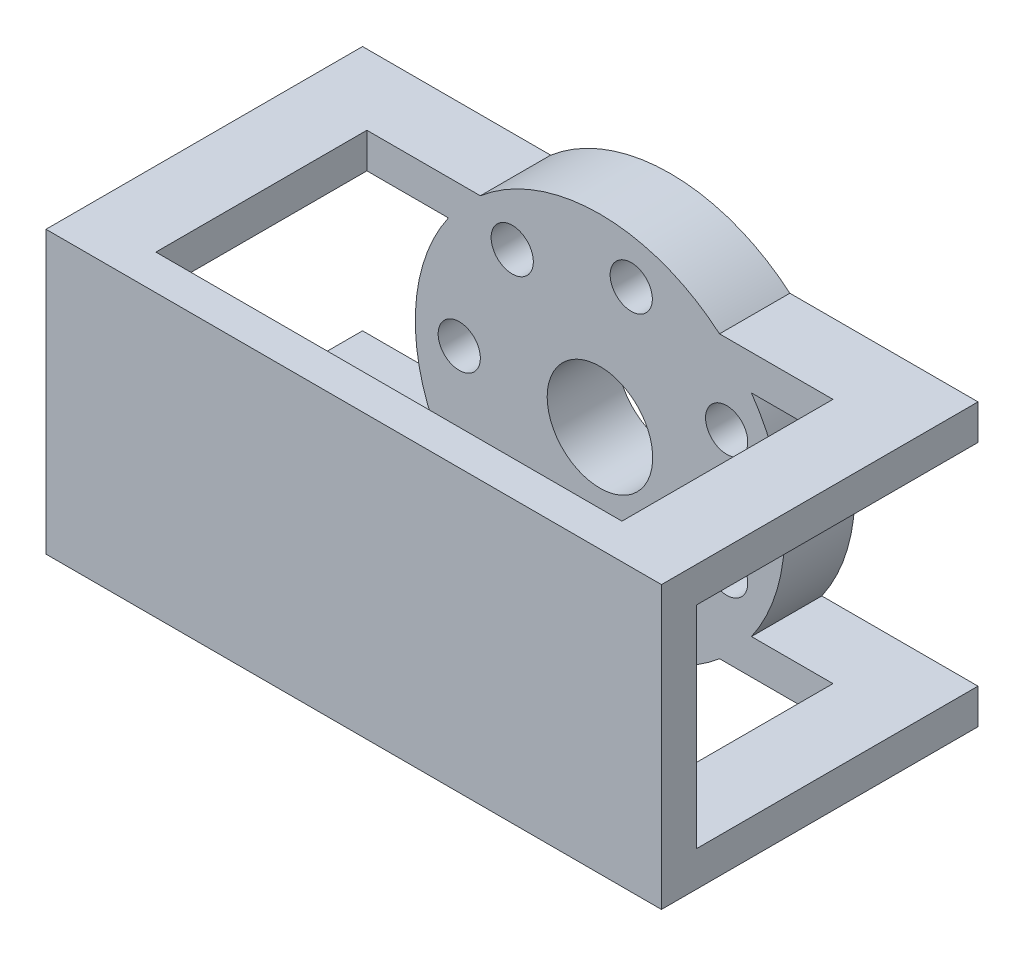
ISO-10303-21;
HEADER;
FILE_DESCRIPTION(('STEP AP214'),'2;1');
FILE_NAME('part.step','',(''),(''),'','','');
FILE_SCHEMA(('AUTOMOTIVE_DESIGN { 1 0 10303 214 1 1 1 1 }'));
ENDSEC;
DATA;
#1=APPLICATION_CONTEXT('core data for automotive mechanical design processes');
#2=APPLICATION_PROTOCOL_DEFINITION('international standard','automotive_design',2000,#1);
#3=PRODUCT_CONTEXT('',#1,'mechanical');
#4=PRODUCT('Part','Part','',(#3));
#5=PRODUCT_RELATED_PRODUCT_CATEGORY('part','',(#4));
#6=PRODUCT_DEFINITION_FORMATION('','',#4);
#7=PRODUCT_DEFINITION_CONTEXT('part definition',#1,'design');
#8=PRODUCT_DEFINITION('design','',#6,#7);
#9=PRODUCT_DEFINITION_SHAPE('','',#8);
#10=(LENGTH_UNIT() NAMED_UNIT(*) SI_UNIT(.MILLI.,.METRE.));
#11=(NAMED_UNIT(*) PLANE_ANGLE_UNIT() SI_UNIT($,.RADIAN.));
#12=(NAMED_UNIT(*) SI_UNIT($,.STERADIAN.) SOLID_ANGLE_UNIT());
#13=UNCERTAINTY_MEASURE_WITH_UNIT(LENGTH_MEASURE(1.E-05),#10,'distance_accuracy_value','');
#14=(GEOMETRIC_REPRESENTATION_CONTEXT(3) GLOBAL_UNCERTAINTY_ASSIGNED_CONTEXT((#13)) GLOBAL_UNIT_ASSIGNED_CONTEXT((#10,
#11,#12)) REPRESENTATION_CONTEXT('',''));
#15=CARTESIAN_POINT('',(0.,0.,0.));
#16=DIRECTION('',(0.,0.,1.));
#17=DIRECTION('',(1.,0.,0.));
#18=AXIS2_PLACEMENT_3D('',#15,#16,#17);
#19=CARTESIAN_POINT('',(-87.5000119999999,10.,0.));
#20=DIRECTION('',(0.,-1.,0.));
#21=DIRECTION('',(0.,0.,-1.));
#22=AXIS2_PLACEMENT_3D('',#19,#20,#21);
#23=PLANE('',#22);
#24=DIRECTION('',(0.,0.,-1.));
#25=VECTOR('',#24,1.);
#26=CARTESIAN_POINT('',(-66.2599702875765,10.,0.));
#27=LINE('',#26,#25);
#28=CARTESIAN_POINT('',(-66.2599702875765,10.,35.));
#29=VERTEX_POINT('',#28);
#30=CARTESIAN_POINT('',(-66.2599702875765,10.,-25.));
#31=VERTEX_POINT('',#30);
#32=EDGE_CURVE('E236',#29,#31,#27,.T.);
#33=ORIENTED_EDGE('',*,*,#32,.T.);
#34=DIRECTION('',(1.,0.,0.));
#35=VECTOR('',#34,1.);
#36=CARTESIAN_POINT('',(-87.5000119999999,10.,-25.));
#37=LINE('',#36,#35);
#38=CARTESIAN_POINT('',(-43.0842198490352,9.99999999999998,-25.));
#39=VERTEX_POINT('',#38);
#40=EDGE_CURVE('E223',#31,#39,#37,.T.);
#41=ORIENTED_EDGE('',*,*,#40,.T.);
#42=DIRECTION('',(0.,0.,-1.));
#43=VECTOR('',#42,1.);
#44=CARTESIAN_POINT('',(-43.0842198490352,9.99999999999998,-25.));
#45=LINE('',#44,#43);
#46=CARTESIAN_POINT('',(-43.0842198490352,9.99999999999998,-45.));
#47=VERTEX_POINT('',#46);
#48=EDGE_CURVE('E378',#39,#47,#45,.T.);
#49=ORIENTED_EDGE('',*,*,#48,.T.);
#50=DIRECTION('',(1.,0.,0.));
#51=VECTOR('',#50,1.);
#52=CARTESIAN_POINT('',(-87.500012,10.,-45.));
#53=LINE('',#52,#51);
#54=CARTESIAN_POINT('',(-87.5,10.,-45.));
#55=VERTEX_POINT('',#54);
#56=EDGE_CURVE('E249',#55,#47,#53,.T.);
#57=ORIENTED_EDGE('',*,*,#56,.F.);
#58=DIRECTION('',(0.,0.,-1.));
#59=VECTOR('',#58,1.);
#60=CARTESIAN_POINT('',(-87.5,10.,-45.));
#61=LINE('',#60,#59);
#62=CARTESIAN_POINT('',(-87.4999999999999,10.,35.));
#63=VERTEX_POINT('',#62);
#64=EDGE_CURVE('E299',#63,#55,#61,.T.);
#65=ORIENTED_EDGE('',*,*,#64,.F.);
#66=DIRECTION('',(1.,0.,0.));
#67=VECTOR('',#66,1.);
#68=CARTESIAN_POINT('',(-87.5000119999999,10.,35.));
#69=LINE('',#68,#67);
#70=EDGE_CURVE('E260',#63,#29,#69,.T.);
#71=ORIENTED_EDGE('',*,*,#70,.T.);
#72=EDGE_LOOP('',(#33,#41,#49,#57,#65,#71));
#73=FACE_BOUND('',#72,.T.);
#74=ADVANCED_FACE('F35',(#73),#23,.F.);
#75=CARTESIAN_POINT('',(-87.5000119999999,70.,0.));
#76=DIRECTION('',(0.,1.,0.));
#77=DIRECTION('',(0.,0.,1.));
#78=AXIS2_PLACEMENT_3D('',#75,#76,#77);
#79=PLANE('',#78);
#80=DIRECTION('',(1.,0.,0.));
#81=VECTOR('',#80,1.);
#82=CARTESIAN_POINT('',(-87.5000119999999,70.,35.));
#83=LINE('',#82,#81);
#84=CARTESIAN_POINT('',(-87.4999999999999,70.,35.));
#85=VERTEX_POINT('',#84);
#86=CARTESIAN_POINT('',(-66.2599702875765,70.,35.));
#87=VERTEX_POINT('',#86);
#88=EDGE_CURVE('E256',#85,#87,#83,.T.);
#89=ORIENTED_EDGE('',*,*,#88,.F.);
#90=DIRECTION('',(0.,0.,1.));
#91=VECTOR('',#90,1.);
#92=CARTESIAN_POINT('',(-87.5,70.,-45.));
#93=LINE('',#92,#91);
#94=CARTESIAN_POINT('',(-87.5,70.,-45.));
#95=VERTEX_POINT('',#94);
#96=EDGE_CURVE('E294',#95,#85,#93,.T.);
#97=ORIENTED_EDGE('',*,*,#96,.F.);
#98=DIRECTION('',(1.,0.,0.));
#99=VECTOR('',#98,1.);
#100=CARTESIAN_POINT('',(-87.500012,70.,-45.));
#101=LINE('',#100,#99);
#102=CARTESIAN_POINT('',(-43.0842198490352,70.,-45.));
#103=VERTEX_POINT('',#102);
#104=EDGE_CURVE('E253',#95,#103,#101,.T.);
#105=ORIENTED_EDGE('',*,*,#104,.T.);
#106=DIRECTION('',(0.,0.,-1.));
#107=VECTOR('',#106,1.);
#108=CARTESIAN_POINT('',(-43.0842198490352,70.,-25.));
#109=LINE('',#108,#107);
#110=CARTESIAN_POINT('',(-43.0842198490352,70.,-25.));
#111=VERTEX_POINT('',#110);
#112=EDGE_CURVE('E311',#111,#103,#109,.T.);
#113=ORIENTED_EDGE('',*,*,#112,.F.);
#114=DIRECTION('',(-1.,0.,0.));
#115=VECTOR('',#114,1.);
#116=CARTESIAN_POINT('',(-87.5000119999999,70.,-25.));
#117=LINE('',#116,#115);
#118=CARTESIAN_POINT('',(-66.2599702875765,70.,-25.));
#119=VERTEX_POINT('',#118);
#120=EDGE_CURVE('E303',#111,#119,#117,.T.);
#121=ORIENTED_EDGE('',*,*,#120,.T.);
#122=DIRECTION('',(0.,0.,1.));
#123=VECTOR('',#122,1.);
#124=CARTESIAN_POINT('',(-66.2599702875765,70.,0.));
#125=LINE('',#124,#123);
#126=EDGE_CURVE('E11',#119,#87,#125,.T.);
#127=ORIENTED_EDGE('',*,*,#126,.T.);
#128=EDGE_LOOP('',(#89,#97,#105,#113,#121,#127));
#129=FACE_BOUND('',#128,.T.);
#130=ADVANCED_FACE('F309',(#129),#79,.F.);
#131=CARTESIAN_POINT('',(87.5,80.,-45.));
#132=DIRECTION('',(-1.,0.,0.));
#133=DIRECTION('',(0.,0.,1.));
#134=AXIS2_PLACEMENT_3D('',#131,#132,#133);
#135=PLANE('',#134);
#136=DIRECTION('',(0.,-1.,0.));
#137=VECTOR('',#136,1.);
#138=CARTESIAN_POINT('',(87.5,80.,-45.));
#139=LINE('',#138,#137);
#140=CARTESIAN_POINT('',(87.5,10.,-45.0000000000001));
#141=VERTEX_POINT('',#140);
#142=CARTESIAN_POINT('',(87.5,0.,-45.));
#143=VERTEX_POINT('',#142);
#144=EDGE_CURVE('E290',#141,#143,#139,.T.);
#145=ORIENTED_EDGE('',*,*,#144,.F.);
#146=DIRECTION('',(0.,0.,-1.));
#147=VECTOR('',#146,1.);
#148=CARTESIAN_POINT('',(87.5,10.,0.));
#149=LINE('',#148,#147);
#150=CARTESIAN_POINT('',(87.5000000000001,10.,35.));
#151=VERTEX_POINT('',#150);
#152=EDGE_CURVE('E242',#151,#141,#149,.T.);
#153=ORIENTED_EDGE('',*,*,#152,.F.);
#154=DIRECTION('',(0.,-1.,0.));
#155=VECTOR('',#154,1.);
#156=CARTESIAN_POINT('',(87.5000000000001,0.,35.));
#157=LINE('',#156,#155);
#158=CARTESIAN_POINT('',(87.5000000000001,70.,35.));
#159=VERTEX_POINT('',#158);
#160=EDGE_CURVE('E244',#159,#151,#157,.T.);
#161=ORIENTED_EDGE('',*,*,#160,.F.);
#162=DIRECTION('',(0.,0.,1.));
#163=VECTOR('',#162,1.);
#164=CARTESIAN_POINT('',(87.5,70.,0.));
#165=LINE('',#164,#163);
#166=CARTESIAN_POINT('',(87.5,70.,-45.0000000000001));
#167=VERTEX_POINT('',#166);
#168=EDGE_CURVE('E247',#167,#159,#165,.T.);
#169=ORIENTED_EDGE('',*,*,#168,.F.);
#170=CARTESIAN_POINT('',(87.5,80.,-45.));
#171=VERTEX_POINT('',#170);
#172=EDGE_CURVE('E291',#171,#167,#139,.T.);
#173=ORIENTED_EDGE('',*,*,#172,.F.);
#174=DIRECTION('',(0.,0.,-1.));
#175=VECTOR('',#174,1.);
#176=CARTESIAN_POINT('',(87.5,80.,-45.));
#177=LINE('',#176,#175);
#178=CARTESIAN_POINT('',(87.5,80.,45.));
#179=VERTEX_POINT('',#178);
#180=EDGE_CURVE('E264',#179,#171,#177,.T.);
#181=ORIENTED_EDGE('',*,*,#180,.F.);
#182=DIRECTION('',(0.,-1.,0.));
#183=VECTOR('',#182,1.);
#184=CARTESIAN_POINT('',(87.5,80.,45.));
#185=LINE('',#184,#183);
#186=CARTESIAN_POINT('',(87.5,0.,45.));
#187=VERTEX_POINT('',#186);
#188=EDGE_CURVE('E273',#179,#187,#185,.T.);
#189=ORIENTED_EDGE('',*,*,#188,.T.);
#190=DIRECTION('',(0.,0.,-1.));
#191=VECTOR('',#190,1.);
#192=CARTESIAN_POINT('',(87.5,0.,-45.));
#193=LINE('',#192,#191);
#194=EDGE_CURVE('E263',#187,#143,#193,.T.);
#195=ORIENTED_EDGE('',*,*,#194,.T.);
#196=EDGE_LOOP('',(#145,#153,#161,#169,#173,#181,#189,#195));
#197=FACE_BOUND('',#196,.T.);
#198=ADVANCED_FACE('F37',(#197),#135,.F.);
#199=CARTESIAN_POINT('',(-87.5,80.,-45.));
#200=DIRECTION('',(0.,0.,1.));
#201=DIRECTION('',(1.,0.,0.));
#202=AXIS2_PLACEMENT_3D('',#199,#200,#201);
#203=PLANE('',#202);
#204=CARTESIAN_POINT('',(-24.9395920743497,71.2732592987209,-45.));
#205=DIRECTION('',(0.,0.,-1.));
#206=DIRECTION('',(-1.,0.,0.));
#207=AXIS2_PLACEMENT_3D('',#204,#205,#206);
#208=CIRCLE('',#207,6.);
#209=CARTESIAN_POINT('',(-30.9395920743497,71.2732592987209,-45.));
#210=VERTEX_POINT('',#209);
#211=EDGE_CURVE('E408',#210,#210,#208,.T.);
#212=ORIENTED_EDGE('',*,*,#211,.F.);
#213=EDGE_LOOP('',(#212));
#214=FACE_BOUND('',#213,.T.);
#215=CARTESIAN_POINT('',(8.9008373582522,78.997116487273,-45.));
#216=DIRECTION('',(0.,0.,-1.));
#217=DIRECTION('',(-1.,0.,0.));
#218=AXIS2_PLACEMENT_3D('',#215,#216,#217);
#219=CIRCLE('',#218,6.);
#220=CARTESIAN_POINT('',(2.9008373582522,78.997116487273,-45.));
#221=VERTEX_POINT('',#220);
#222=EDGE_CURVE('E414',#221,#221,#219,.T.);
#223=ORIENTED_EDGE('',*,*,#222,.F.);
#224=EDGE_LOOP('',(#223));
#225=FACE_BOUND('',#224,.T.);
#226=CARTESIAN_POINT('',(36.0387547160966,57.3553495647026,-45.));
#227=DIRECTION('',(0.,0.,-1.));
#228=DIRECTION('',(-1.,0.,0.));
#229=AXIS2_PLACEMENT_3D('',#226,#227,#228);
#230=CIRCLE('',#229,6.00000000000001);
#231=CARTESIAN_POINT('',(30.0387547160966,57.3553495647026,-45.));
#232=VERTEX_POINT('',#231);
#233=EDGE_CURVE('E420',#232,#232,#230,.T.);
#234=ORIENTED_EDGE('',*,*,#233,.F.);
#235=EDGE_LOOP('',(#234));
#236=FACE_BOUND('',#235,.T.);
#237=CARTESIAN_POINT('',(36.0387547160969,22.6446504352979,-45.));
#238=DIRECTION('',(0.,0.,-1.));
#239=DIRECTION('',(-1.,0.,0.));
#240=AXIS2_PLACEMENT_3D('',#237,#238,#239);
#241=CIRCLE('',#240,6.);
#242=CARTESIAN_POINT('',(30.0387547160969,22.6446504352979,-45.));
#243=VERTEX_POINT('',#242);
#244=EDGE_CURVE('E426',#243,#243,#241,.T.);
#245=ORIENTED_EDGE('',*,*,#244,.F.);
#246=EDGE_LOOP('',(#245));
#247=FACE_BOUND('',#246,.T.);
#248=CARTESIAN_POINT('',(8.90083735825274,1.00288351272711,-45.));
#249=DIRECTION('',(0.,0.,-1.));
#250=DIRECTION('',(-1.,0.,0.));
#251=AXIS2_PLACEMENT_3D('',#248,#249,#250);
#252=CIRCLE('',#251,6.);
#253=CARTESIAN_POINT('',(2.90083735825274,1.00288351272711,-45.));
#254=VERTEX_POINT('',#253);
#255=EDGE_CURVE('E432',#254,#254,#252,.T.);
#256=ORIENTED_EDGE('',*,*,#255,.F.);
#257=EDGE_LOOP('',(#256));
#258=FACE_BOUND('',#257,.T.);
#259=CARTESIAN_POINT('',(-24.9395920743493,8.72674070127877,-45.));
#260=DIRECTION('',(0.,0.,-1.));
#261=DIRECTION('',(-1.,0.,0.));
#262=AXIS2_PLACEMENT_3D('',#259,#260,#261);
#263=CIRCLE('',#262,5.99999999999999);
#264=CARTESIAN_POINT('',(-30.9395920743493,8.72674070127877,-45.));
#265=VERTEX_POINT('',#264);
#266=EDGE_CURVE('E438',#265,#265,#263,.T.);
#267=ORIENTED_EDGE('',*,*,#266,.F.);
#268=EDGE_LOOP('',(#267));
#269=FACE_BOUND('',#268,.T.);
#270=CARTESIAN_POINT('',(-40.,40.,-45.));
#271=DIRECTION('',(0.,0.,-1.));
#272=DIRECTION('',(-1.,0.,0.));
#273=AXIS2_PLACEMENT_3D('',#270,#271,#272);
#274=CIRCLE('',#273,5.99999999999999);
#275=CARTESIAN_POINT('',(-46.,40.,-45.));
#276=VERTEX_POINT('',#275);
#277=EDGE_CURVE('E444',#276,#276,#274,.T.);
#278=ORIENTED_EDGE('',*,*,#277,.F.);
#279=EDGE_LOOP('',(#278));
#280=FACE_BOUND('',#279,.T.);
#281=CARTESIAN_POINT('',(0.,40.,-45.));
#282=DIRECTION('',(0.,0.,-1.));
#283=DIRECTION('',(-1.,0.,0.));
#284=AXIS2_PLACEMENT_3D('',#281,#282,#283);
#285=CIRCLE('',#284,15.);
#286=CARTESIAN_POINT('',(-15.,40.,-45.));
#287=VERTEX_POINT('',#286);
#288=EDGE_CURVE('E361',#287,#287,#285,.T.);
#289=ORIENTED_EDGE('',*,*,#288,.F.);
#290=EDGE_LOOP('',(#289));
#291=FACE_BOUND('',#290,.T.);
#292=ORIENTED_EDGE('',*,*,#172,.T.);
#293=CARTESIAN_POINT('',(43.0842198490352,70.,-45.));
#294=VERTEX_POINT('',#293);
#295=EDGE_CURVE('E252',#294,#167,#101,.T.);
#296=ORIENTED_EDGE('',*,*,#295,.F.);
#297=CARTESIAN_POINT('',(0.,40.,-45.));
#298=DIRECTION('',(0.,0.,-1.));
#299=DIRECTION('',(-1.,0.,0.));
#300=AXIS2_PLACEMENT_3D('',#297,#298,#299);
#301=CIRCLE('',#300,52.5);
#302=CARTESIAN_POINT('',(43.0842198490352,10.,-45.));
#303=VERTEX_POINT('',#302);
#304=EDGE_CURVE('E355',#294,#303,#301,.T.);
#305=ORIENTED_EDGE('',*,*,#304,.T.);
#306=EDGE_CURVE('E216',#303,#141,#53,.T.);
#307=ORIENTED_EDGE('',*,*,#306,.T.);
#308=ORIENTED_EDGE('',*,*,#144,.T.);
#309=DIRECTION('',(-1.,0.,0.));
#310=VECTOR('',#309,1.);
#311=CARTESIAN_POINT('',(-87.5,0.,-45.));
#312=LINE('',#311,#310);
#313=CARTESIAN_POINT('',(34.0036762718386,0.,-45.));
#314=VERTEX_POINT('',#313);
#315=EDGE_CURVE('E276',#143,#314,#312,.T.);
#316=ORIENTED_EDGE('',*,*,#315,.T.);
#317=CARTESIAN_POINT('',(0.,40.,-45.));
#318=DIRECTION('',(0.,0.,-1.));
#319=DIRECTION('',(-1.,0.,0.));
#320=AXIS2_PLACEMENT_3D('',#317,#318,#319);
#321=CIRCLE('',#320,52.5);
#322=CARTESIAN_POINT('',(-34.0036762718386,0.,-45.));
#323=VERTEX_POINT('',#322);
#324=EDGE_CURVE('E58',#314,#323,#321,.T.);
#325=ORIENTED_EDGE('',*,*,#324,.T.);
#326=CARTESIAN_POINT('',(-87.5,0.,-45.));
#327=VERTEX_POINT('',#326);
#328=EDGE_CURVE('E275',#323,#327,#312,.T.);
#329=ORIENTED_EDGE('',*,*,#328,.T.);
#330=DIRECTION('',(0.,-1.,0.));
#331=VECTOR('',#330,1.);
#332=CARTESIAN_POINT('',(-87.5,80.,-45.));
#333=LINE('',#332,#331);
#334=EDGE_CURVE('E286',#55,#327,#333,.T.);
#335=ORIENTED_EDGE('',*,*,#334,.F.);
#336=ORIENTED_EDGE('',*,*,#56,.T.);
#337=CARTESIAN_POINT('',(0.,40.,-45.));
#338=DIRECTION('',(0.,0.,-1.));
#339=DIRECTION('',(-1.,0.,0.));
#340=AXIS2_PLACEMENT_3D('',#337,#338,#339);
#341=CIRCLE('',#340,52.5);
#342=EDGE_CURVE('E358',#47,#103,#341,.T.);
#343=ORIENTED_EDGE('',*,*,#342,.T.);
#344=ORIENTED_EDGE('',*,*,#104,.F.);
#345=CARTESIAN_POINT('',(-87.5,80.,-45.));
#346=VERTEX_POINT('',#345);
#347=EDGE_CURVE('E287',#346,#95,#333,.T.);
#348=ORIENTED_EDGE('',*,*,#347,.F.);
#349=DIRECTION('',(-1.,0.,0.));
#350=VECTOR('',#349,1.);
#351=CARTESIAN_POINT('',(-87.5,80.,-45.));
#352=LINE('',#351,#350);
#353=CARTESIAN_POINT('',(-34.0036762718386,80.,-45.));
#354=VERTEX_POINT('',#353);
#355=EDGE_CURVE('E266',#354,#346,#352,.T.);
#356=ORIENTED_EDGE('',*,*,#355,.F.);
#357=CARTESIAN_POINT('',(0.,40.,-45.));
#358=DIRECTION('',(0.,0.,-1.));
#359=DIRECTION('',(-1.,0.,0.));
#360=AXIS2_PLACEMENT_3D('',#357,#358,#359);
#361=CIRCLE('',#360,52.5);
#362=CARTESIAN_POINT('',(34.0036762718386,80.,-45.));
#363=VERTEX_POINT('',#362);
#364=EDGE_CURVE('E208',#354,#363,#361,.T.);
#365=ORIENTED_EDGE('',*,*,#364,.T.);
#366=EDGE_CURVE('E50',#171,#363,#352,.T.);
#367=ORIENTED_EDGE('',*,*,#366,.F.);
#368=EDGE_LOOP('',(#292,#296,#305,#307,#308,#316,#325,#329,#335,#336,#343,#344,#348,#356,#365,#367));
#369=FACE_BOUND('',#368,.T.);
#370=ADVANCED_FACE('F353',(#214,#225,#236,#247,#258,#269,#280,#291,#369),#203,.F.);
#371=CARTESIAN_POINT('',(-87.5,80.,-45.));
#372=DIRECTION('',(1.,0.,0.));
#373=DIRECTION('',(0.,0.,-1.));
#374=AXIS2_PLACEMENT_3D('',#371,#372,#373);
#375=PLANE('',#374);
#376=ORIENTED_EDGE('',*,*,#96,.T.);
#377=DIRECTION('',(0.,-1.,0.));
#378=VECTOR('',#377,1.);
#379=CARTESIAN_POINT('',(-87.4999999999999,80.,35.));
#380=LINE('',#379,#378);
#381=EDGE_CURVE('E296',#85,#63,#380,.T.);
#382=ORIENTED_EDGE('',*,*,#381,.T.);
#383=ORIENTED_EDGE('',*,*,#64,.T.);
#384=ORIENTED_EDGE('',*,*,#334,.T.);
#385=DIRECTION('',(0.,0.,1.));
#386=VECTOR('',#385,1.);
#387=CARTESIAN_POINT('',(-87.5,0.,-45.));
#388=LINE('',#387,#386);
#389=CARTESIAN_POINT('',(-87.4999999999999,0.,45.));
#390=VERTEX_POINT('',#389);
#391=EDGE_CURVE('E278',#327,#390,#388,.T.);
#392=ORIENTED_EDGE('',*,*,#391,.T.);
#393=DIRECTION('',(0.,-1.,0.));
#394=VECTOR('',#393,1.);
#395=CARTESIAN_POINT('',(-87.4999999999999,80.,45.));
#396=LINE('',#395,#394);
#397=CARTESIAN_POINT('',(-87.4999999999999,80.,45.));
#398=VERTEX_POINT('',#397);
#399=EDGE_CURVE('E283',#398,#390,#396,.T.);
#400=ORIENTED_EDGE('',*,*,#399,.F.);
#401=DIRECTION('',(0.,0.,1.));
#402=VECTOR('',#401,1.);
#403=CARTESIAN_POINT('',(-87.5,80.,-45.));
#404=LINE('',#403,#402);
#405=EDGE_CURVE('E269',#346,#398,#404,.T.);
#406=ORIENTED_EDGE('',*,*,#405,.F.);
#407=ORIENTED_EDGE('',*,*,#347,.T.);
#408=EDGE_LOOP('',(#376,#382,#383,#384,#392,#400,#406,#407));
#409=FACE_BOUND('',#408,.T.);
#410=ADVANCED_FACE('F462',(#409),#375,.F.);
#411=CARTESIAN_POINT('',(-87.4999999999999,80.,45.));
#412=DIRECTION('',(0.,0.,-1.));
#413=DIRECTION('',(-1.,0.,0.));
#414=AXIS2_PLACEMENT_3D('',#411,#412,#413);
#415=PLANE('',#414);
#416=DIRECTION('',(1.,0.,0.));
#417=VECTOR('',#416,1.);
#418=CARTESIAN_POINT('',(-87.4999999999999,0.,45.));
#419=LINE('',#418,#417);
#420=EDGE_CURVE('E267',#390,#187,#419,.T.);
#421=ORIENTED_EDGE('',*,*,#420,.T.);
#422=ORIENTED_EDGE('',*,*,#188,.F.);
#423=DIRECTION('',(1.,0.,0.));
#424=VECTOR('',#423,1.);
#425=CARTESIAN_POINT('',(-87.4999999999999,80.,45.));
#426=LINE('',#425,#424);
#427=EDGE_CURVE('E271',#398,#179,#426,.T.);
#428=ORIENTED_EDGE('',*,*,#427,.F.);
#429=ORIENTED_EDGE('',*,*,#399,.T.);
#430=EDGE_LOOP('',(#421,#422,#428,#429));
#431=FACE_BOUND('',#430,.T.);
#432=ADVANCED_FACE('F498',(#431),#415,.F.);
#433=CARTESIAN_POINT('',(0.,80.,0.));
#434=DIRECTION('',(0.,1.,0.));
#435=DIRECTION('',(0.,0.,1.));
#436=AXIS2_PLACEMENT_3D('',#433,#434,#435);
#437=PLANE('',#436);
#438=DIRECTION('',(0.,0.,-1.));
#439=VECTOR('',#438,1.);
#440=CARTESIAN_POINT('',(-34.0036762718386,80.,-25.));
#441=LINE('',#440,#439);
#442=CARTESIAN_POINT('',(-34.0036762718386,80.,-25.));
#443=VERTEX_POINT('',#442);
#444=EDGE_CURVE('E374',#443,#354,#441,.T.);
#445=ORIENTED_EDGE('',*,*,#444,.T.);
#446=ORIENTED_EDGE('',*,*,#355,.T.);
#447=ORIENTED_EDGE('',*,*,#405,.T.);
#448=ORIENTED_EDGE('',*,*,#427,.T.);
#449=ORIENTED_EDGE('',*,*,#180,.T.);
#450=ORIENTED_EDGE('',*,*,#366,.T.);
#451=DIRECTION('',(0.,0.,-1.));
#452=VECTOR('',#451,1.);
#453=CARTESIAN_POINT('',(34.0036762718386,80.,-25.));
#454=LINE('',#453,#452);
#455=CARTESIAN_POINT('',(34.0036762718386,80.,-25.));
#456=VERTEX_POINT('',#455);
#457=EDGE_CURVE('E371',#456,#363,#454,.T.);
#458=ORIENTED_EDGE('',*,*,#457,.F.);
#459=DIRECTION('',(-1.,0.,0.));
#460=VECTOR('',#459,1.);
#461=CARTESIAN_POINT('',(-66.2599702875765,80.,-25.));
#462=LINE('',#461,#460);
#463=CARTESIAN_POINT('',(66.2599702875765,80.,-25.));
#464=VERTEX_POINT('',#463);
#465=EDGE_CURVE('E331',#464,#456,#462,.T.);
#466=ORIENTED_EDGE('',*,*,#465,.F.);
#467=DIRECTION('',(0.,0.,-1.));
#468=VECTOR('',#467,1.);
#469=CARTESIAN_POINT('',(66.2599702875765,80.,-25.));
#470=LINE('',#469,#468);
#471=CARTESIAN_POINT('',(66.2599702875765,80.,35.));
#472=VERTEX_POINT('',#471);
#473=EDGE_CURVE('E389',#472,#464,#470,.T.);
#474=ORIENTED_EDGE('',*,*,#473,.F.);
#475=DIRECTION('',(1.,0.,0.));
#476=VECTOR('',#475,1.);
#477=CARTESIAN_POINT('',(-66.2599702875765,80.,35.));
#478=LINE('',#477,#476);
#479=CARTESIAN_POINT('',(-66.2599702875765,80.,35.));
#480=VERTEX_POINT('',#479);
#481=EDGE_CURVE('E387',#480,#472,#478,.T.);
#482=ORIENTED_EDGE('',*,*,#481,.F.);
#483=DIRECTION('',(0.,0.,1.));
#484=VECTOR('',#483,1.);
#485=CARTESIAN_POINT('',(-66.2599702875765,80.,-25.));
#486=LINE('',#485,#484);
#487=CARTESIAN_POINT('',(-66.2599702875765,80.,-25.));
#488=VERTEX_POINT('',#487);
#489=EDGE_CURVE('E373',#488,#480,#486,.T.);
#490=ORIENTED_EDGE('',*,*,#489,.F.);
#491=EDGE_CURVE('E323',#443,#488,#462,.T.);
#492=ORIENTED_EDGE('',*,*,#491,.F.);
#493=EDGE_LOOP('',(#445,#446,#447,#448,#449,#450,#458,#466,#474,#482,#490,#492));
#494=FACE_BOUND('',#493,.T.);
#495=ADVANCED_FACE('F492',(#494),#437,.T.);
#496=CARTESIAN_POINT('',(0.,0.,0.));
#497=DIRECTION('',(0.,1.,0.));
#498=DIRECTION('',(0.,0.,1.));
#499=AXIS2_PLACEMENT_3D('',#496,#497,#498);
#500=PLANE('',#499);
#501=ORIENTED_EDGE('',*,*,#328,.F.);
#502=DIRECTION('',(0.,0.,-1.));
#503=VECTOR('',#502,1.);
#504=CARTESIAN_POINT('',(-34.0036762718386,0.,-25.));
#505=LINE('',#504,#503);
#506=CARTESIAN_POINT('',(-34.0036762718386,0.,-25.));
#507=VERTEX_POINT('',#506);
#508=EDGE_CURVE('E381',#507,#323,#505,.T.);
#509=ORIENTED_EDGE('',*,*,#508,.F.);
#510=DIRECTION('',(-1.,0.,0.));
#511=VECTOR('',#510,1.);
#512=CARTESIAN_POINT('',(0.,0.,-25.));
#513=LINE('',#512,#511);
#514=CARTESIAN_POINT('',(-66.2599702875765,0.,-25.));
#515=VERTEX_POINT('',#514);
#516=EDGE_CURVE('E227',#507,#515,#513,.T.);
#517=ORIENTED_EDGE('',*,*,#516,.T.);
#518=DIRECTION('',(0.,0.,1.));
#519=VECTOR('',#518,1.);
#520=CARTESIAN_POINT('',(-66.2599702875765,0.,0.));
#521=LINE('',#520,#519);
#522=CARTESIAN_POINT('',(-66.2599702875765,0.,35.));
#523=VERTEX_POINT('',#522);
#524=EDGE_CURVE('E239',#515,#523,#521,.T.);
#525=ORIENTED_EDGE('',*,*,#524,.T.);
#526=DIRECTION('',(1.,0.,0.));
#527=VECTOR('',#526,1.);
#528=CARTESIAN_POINT('',(0.,0.,35.));
#529=LINE('',#528,#527);
#530=CARTESIAN_POINT('',(66.2599702875765,0.,35.));
#531=VERTEX_POINT('',#530);
#532=EDGE_CURVE('E327',#523,#531,#529,.T.);
#533=ORIENTED_EDGE('',*,*,#532,.T.);
#534=DIRECTION('',(0.,0.,-1.));
#535=VECTOR('',#534,1.);
#536=CARTESIAN_POINT('',(66.2599702875765,0.,0.));
#537=LINE('',#536,#535);
#538=CARTESIAN_POINT('',(66.2599702875765,0.,-25.));
#539=VERTEX_POINT('',#538);
#540=EDGE_CURVE('E224',#531,#539,#537,.T.);
#541=ORIENTED_EDGE('',*,*,#540,.T.);
#542=CARTESIAN_POINT('',(34.0036762718386,0.,-25.));
#543=VERTEX_POINT('',#542);
#544=EDGE_CURVE('E233',#539,#543,#513,.T.);
#545=ORIENTED_EDGE('',*,*,#544,.T.);
#546=DIRECTION('',(0.,0.,-1.));
#547=VECTOR('',#546,1.);
#548=CARTESIAN_POINT('',(34.0036762718386,0.,-25.));
#549=LINE('',#548,#547);
#550=EDGE_CURVE('E217',#543,#314,#549,.T.);
#551=ORIENTED_EDGE('',*,*,#550,.T.);
#552=ORIENTED_EDGE('',*,*,#315,.F.);
#553=ORIENTED_EDGE('',*,*,#194,.F.);
#554=ORIENTED_EDGE('',*,*,#420,.F.);
#555=ORIENTED_EDGE('',*,*,#391,.F.);
#556=EDGE_LOOP('',(#501,#509,#517,#525,#533,#541,#545,#551,#552,#553,#554,#555));
#557=FACE_BOUND('',#556,.T.);
#558=ADVANCED_FACE('F487',(#557),#500,.F.);
#559=ORIENTED_EDGE('',*,*,#306,.F.);
#560=DIRECTION('',(0.,0.,-1.));
#561=VECTOR('',#560,1.);
#562=CARTESIAN_POINT('',(43.0842198490352,10.,-25.));
#563=LINE('',#562,#561);
#564=CARTESIAN_POINT('',(43.0842198490352,10.,-25.));
#565=VERTEX_POINT('',#564);
#566=EDGE_CURVE('E201',#565,#303,#563,.T.);
#567=ORIENTED_EDGE('',*,*,#566,.F.);
#568=CARTESIAN_POINT('',(66.2599702875765,10.,-25.));
#569=VERTEX_POINT('',#568);
#570=EDGE_CURVE('E213',#565,#569,#37,.T.);
#571=ORIENTED_EDGE('',*,*,#570,.T.);
#572=DIRECTION('',(0.,0.,1.));
#573=VECTOR('',#572,1.);
#574=CARTESIAN_POINT('',(66.2599702875765,10.,0.));
#575=LINE('',#574,#573);
#576=CARTESIAN_POINT('',(66.2599702875765,10.,35.));
#577=VERTEX_POINT('',#576);
#578=EDGE_CURVE('E229',#569,#577,#575,.T.);
#579=ORIENTED_EDGE('',*,*,#578,.T.);
#580=EDGE_CURVE('E259',#577,#151,#69,.T.);
#581=ORIENTED_EDGE('',*,*,#580,.T.);
#582=ORIENTED_EDGE('',*,*,#152,.T.);
#583=EDGE_LOOP('',(#559,#567,#571,#579,#581,#582));
#584=FACE_BOUND('',#583,.T.);
#585=ADVANCED_FACE('F211',(#584),#23,.F.);
#586=CARTESIAN_POINT('',(-87.5000119999999,0.,35.));
#587=DIRECTION('',(0.,0.,1.));
#588=DIRECTION('',(1.,0.,0.));
#589=AXIS2_PLACEMENT_3D('',#586,#587,#588);
#590=PLANE('',#589);
#591=ORIENTED_EDGE('',*,*,#580,.F.);
#592=DIRECTION('',(0.,1.,0.));
#593=VECTOR('',#592,1.);
#594=CARTESIAN_POINT('',(66.2599702875765,-95.,35.));
#595=LINE('',#594,#593);
#596=EDGE_CURVE('E334',#531,#577,#595,.T.);
#597=ORIENTED_EDGE('',*,*,#596,.F.);
#598=ORIENTED_EDGE('',*,*,#532,.F.);
#599=DIRECTION('',(0.,1.,0.));
#600=VECTOR('',#599,1.);
#601=CARTESIAN_POINT('',(-66.2599702875765,-95.,35.));
#602=LINE('',#601,#600);
#603=EDGE_CURVE('E337',#523,#29,#602,.T.);
#604=ORIENTED_EDGE('',*,*,#603,.T.);
#605=ORIENTED_EDGE('',*,*,#70,.F.);
#606=ORIENTED_EDGE('',*,*,#381,.F.);
#607=ORIENTED_EDGE('',*,*,#88,.T.);
#608=EDGE_CURVE('E321',#87,#480,#602,.T.);
#609=ORIENTED_EDGE('',*,*,#608,.T.);
#610=ORIENTED_EDGE('',*,*,#481,.T.);
#611=CARTESIAN_POINT('',(66.2599702875764,70.,35.));
#612=VERTEX_POINT('',#611);
#613=EDGE_CURVE('E335',#612,#472,#595,.T.);
#614=ORIENTED_EDGE('',*,*,#613,.F.);
#615=EDGE_CURVE('E255',#612,#159,#83,.T.);
#616=ORIENTED_EDGE('',*,*,#615,.T.);
#617=ORIENTED_EDGE('',*,*,#160,.T.);
#618=EDGE_LOOP('',(#591,#597,#598,#604,#605,#606,#607,#609,#610,#614,#616,#617));
#619=FACE_BOUND('',#618,.T.);
#620=ADVANCED_FACE('F343',(#619),#590,.F.);
#621=CARTESIAN_POINT('',(66.2599702875765,70.,-25.));
#622=VERTEX_POINT('',#621);
#623=CARTESIAN_POINT('',(43.0842198490352,70.,-25.));
#624=VERTEX_POINT('',#623);
#625=EDGE_CURVE('E43',#622,#624,#117,.T.);
#626=ORIENTED_EDGE('',*,*,#625,.T.);
#627=DIRECTION('',(0.,0.,-1.));
#628=VECTOR('',#627,1.);
#629=CARTESIAN_POINT('',(43.0842198490352,70.,-25.));
#630=LINE('',#629,#628);
#631=EDGE_CURVE('E204',#624,#294,#630,.T.);
#632=ORIENTED_EDGE('',*,*,#631,.T.);
#633=ORIENTED_EDGE('',*,*,#295,.T.);
#634=ORIENTED_EDGE('',*,*,#168,.T.);
#635=ORIENTED_EDGE('',*,*,#615,.F.);
#636=DIRECTION('',(0.,0.,-1.));
#637=VECTOR('',#636,1.);
#638=CARTESIAN_POINT('',(66.2599702875765,70.,0.));
#639=LINE('',#638,#637);
#640=EDGE_CURVE('E301',#612,#622,#639,.T.);
#641=ORIENTED_EDGE('',*,*,#640,.T.);
#642=EDGE_LOOP('',(#626,#632,#633,#634,#635,#641));
#643=FACE_BOUND('',#642,.T.);
#644=ADVANCED_FACE('F483',(#643),#79,.F.);
#645=CARTESIAN_POINT('',(66.2599702875765,-95.,-25.));
#646=DIRECTION('',(1.,0.,0.));
#647=DIRECTION('',(0.,0.,-1.));
#648=AXIS2_PLACEMENT_3D('',#645,#646,#647);
#649=PLANE('',#648);
#650=ORIENTED_EDGE('',*,*,#613,.T.);
#651=ORIENTED_EDGE('',*,*,#473,.T.);
#652=DIRECTION('',(0.,1.,0.));
#653=VECTOR('',#652,1.);
#654=CARTESIAN_POINT('',(66.2599702875765,-95.,-25.));
#655=LINE('',#654,#653);
#656=EDGE_CURVE('E328',#622,#464,#655,.T.);
#657=ORIENTED_EDGE('',*,*,#656,.F.);
#658=ORIENTED_EDGE('',*,*,#640,.F.);
#659=EDGE_LOOP('',(#650,#651,#657,#658));
#660=FACE_BOUND('',#659,.T.);
#661=ADVANCED_FACE('F529',(#660),#649,.F.);
#662=CARTESIAN_POINT('',(-66.2599702875765,-95.,-25.));
#663=DIRECTION('',(-1.,0.,0.));
#664=DIRECTION('',(0.,0.,1.));
#665=AXIS2_PLACEMENT_3D('',#662,#663,#664);
#666=PLANE('',#665);
#667=DIRECTION('',(0.,1.,0.));
#668=VECTOR('',#667,1.);
#669=CARTESIAN_POINT('',(-66.2599702875765,-95.,-25.));
#670=LINE('',#669,#668);
#671=EDGE_CURVE('E318',#119,#488,#670,.T.);
#672=ORIENTED_EDGE('',*,*,#671,.T.);
#673=ORIENTED_EDGE('',*,*,#489,.T.);
#674=ORIENTED_EDGE('',*,*,#608,.F.);
#675=ORIENTED_EDGE('',*,*,#126,.F.);
#676=EDGE_LOOP('',(#672,#673,#674,#675));
#677=FACE_BOUND('',#676,.T.);
#678=ADVANCED_FACE('F317',(#677),#666,.F.);
#679=EDGE_CURVE('E324',#515,#31,#670,.T.);
#680=ORIENTED_EDGE('',*,*,#679,.T.);
#681=ORIENTED_EDGE('',*,*,#32,.F.);
#682=ORIENTED_EDGE('',*,*,#603,.F.);
#683=ORIENTED_EDGE('',*,*,#524,.F.);
#684=EDGE_LOOP('',(#680,#681,#682,#683));
#685=FACE_BOUND('',#684,.T.);
#686=ADVANCED_FACE('F537',(#685),#666,.F.);
#687=CARTESIAN_POINT('',(-66.2599702875765,-95.,-25.));
#688=DIRECTION('',(0.,0.,-1.));
#689=DIRECTION('',(-1.,0.,0.));
#690=AXIS2_PLACEMENT_3D('',#687,#688,#689);
#691=PLANE('',#690);
#692=CARTESIAN_POINT('',(-24.9395920743497,71.2732592987209,-25.));
#693=DIRECTION('',(0.,0.,-1.));
#694=DIRECTION('',(-1.,0.,0.));
#695=AXIS2_PLACEMENT_3D('',#692,#693,#694);
#696=CIRCLE('',#695,6.);
#697=CARTESIAN_POINT('',(-30.9395920743497,71.2732592987209,-25.));
#698=VERTEX_POINT('',#697);
#699=EDGE_CURVE('E411',#698,#698,#696,.T.);
#700=ORIENTED_EDGE('',*,*,#699,.T.);
#701=EDGE_LOOP('',(#700));
#702=FACE_BOUND('',#701,.T.);
#703=CARTESIAN_POINT('',(8.9008373582522,78.997116487273,-25.));
#704=DIRECTION('',(0.,0.,-1.));
#705=DIRECTION('',(-1.,0.,0.));
#706=AXIS2_PLACEMENT_3D('',#703,#704,#705);
#707=CIRCLE('',#706,6.);
#708=CARTESIAN_POINT('',(2.9008373582522,78.997116487273,-25.));
#709=VERTEX_POINT('',#708);
#710=EDGE_CURVE('E417',#709,#709,#707,.T.);
#711=ORIENTED_EDGE('',*,*,#710,.T.);
#712=EDGE_LOOP('',(#711));
#713=FACE_BOUND('',#712,.T.);
#714=CARTESIAN_POINT('',(36.0387547160966,57.3553495647026,-25.));
#715=DIRECTION('',(0.,0.,-1.));
#716=DIRECTION('',(-1.,0.,0.));
#717=AXIS2_PLACEMENT_3D('',#714,#715,#716);
#718=CIRCLE('',#717,6.00000000000001);
#719=CARTESIAN_POINT('',(30.0387547160966,57.3553495647026,-25.));
#720=VERTEX_POINT('',#719);
#721=EDGE_CURVE('E423',#720,#720,#718,.T.);
#722=ORIENTED_EDGE('',*,*,#721,.T.);
#723=EDGE_LOOP('',(#722));
#724=FACE_BOUND('',#723,.T.);
#725=CARTESIAN_POINT('',(36.0387547160969,22.6446504352979,-25.));
#726=DIRECTION('',(0.,0.,-1.));
#727=DIRECTION('',(-1.,0.,0.));
#728=AXIS2_PLACEMENT_3D('',#725,#726,#727);
#729=CIRCLE('',#728,6.);
#730=CARTESIAN_POINT('',(30.0387547160969,22.6446504352979,-25.));
#731=VERTEX_POINT('',#730);
#732=EDGE_CURVE('E429',#731,#731,#729,.T.);
#733=ORIENTED_EDGE('',*,*,#732,.T.);
#734=EDGE_LOOP('',(#733));
#735=FACE_BOUND('',#734,.T.);
#736=CARTESIAN_POINT('',(8.90083735825274,1.00288351272711,-25.));
#737=DIRECTION('',(0.,0.,-1.));
#738=DIRECTION('',(-1.,0.,0.));
#739=AXIS2_PLACEMENT_3D('',#736,#737,#738);
#740=CIRCLE('',#739,6.);
#741=CARTESIAN_POINT('',(2.90083735825274,1.00288351272711,-25.));
#742=VERTEX_POINT('',#741);
#743=EDGE_CURVE('E435',#742,#742,#740,.T.);
#744=ORIENTED_EDGE('',*,*,#743,.T.);
#745=EDGE_LOOP('',(#744));
#746=FACE_BOUND('',#745,.T.);
#747=CARTESIAN_POINT('',(-24.9395920743493,8.72674070127877,-25.));
#748=DIRECTION('',(0.,0.,-1.));
#749=DIRECTION('',(-1.,0.,0.));
#750=AXIS2_PLACEMENT_3D('',#747,#748,#749);
#751=CIRCLE('',#750,5.99999999999999);
#752=CARTESIAN_POINT('',(-30.9395920743493,8.72674070127877,-25.));
#753=VERTEX_POINT('',#752);
#754=EDGE_CURVE('E441',#753,#753,#751,.T.);
#755=ORIENTED_EDGE('',*,*,#754,.T.);
#756=EDGE_LOOP('',(#755));
#757=FACE_BOUND('',#756,.T.);
#758=CARTESIAN_POINT('',(-40.,40.,-25.));
#759=DIRECTION('',(0.,0.,-1.));
#760=DIRECTION('',(-1.,0.,0.));
#761=AXIS2_PLACEMENT_3D('',#758,#759,#760);
#762=CIRCLE('',#761,5.99999999999999);
#763=CARTESIAN_POINT('',(-46.,40.,-25.));
#764=VERTEX_POINT('',#763);
#765=EDGE_CURVE('E406',#764,#764,#762,.T.);
#766=ORIENTED_EDGE('',*,*,#765,.T.);
#767=EDGE_LOOP('',(#766));
#768=FACE_BOUND('',#767,.T.);
#769=CARTESIAN_POINT('',(0.,40.,-25.));
#770=DIRECTION('',(0.,0.,-1.));
#771=DIRECTION('',(-1.,0.,0.));
#772=AXIS2_PLACEMENT_3D('',#769,#770,#771);
#773=CIRCLE('',#772,15.);
#774=CARTESIAN_POINT('',(-15.,40.,-25.));
#775=VERTEX_POINT('',#774);
#776=EDGE_CURVE('E356',#775,#775,#773,.T.);
#777=ORIENTED_EDGE('',*,*,#776,.T.);
#778=EDGE_LOOP('',(#777));
#779=FACE_BOUND('',#778,.T.);
#780=EDGE_CURVE('E222',#539,#569,#655,.T.);
#781=ORIENTED_EDGE('',*,*,#780,.T.);
#782=ORIENTED_EDGE('',*,*,#570,.F.);
#783=CARTESIAN_POINT('',(0.,40.,-25.));
#784=DIRECTION('',(0.,0.,-1.));
#785=DIRECTION('',(-1.,0.,0.));
#786=AXIS2_PLACEMENT_3D('',#783,#784,#785);
#787=CIRCLE('',#786,52.5);
#788=EDGE_CURVE('E197',#624,#565,#787,.T.);
#789=ORIENTED_EDGE('',*,*,#788,.F.);
#790=ORIENTED_EDGE('',*,*,#625,.F.);
#791=ORIENTED_EDGE('',*,*,#656,.T.);
#792=ORIENTED_EDGE('',*,*,#465,.T.);
#793=CARTESIAN_POINT('',(0.,40.,-25.));
#794=DIRECTION('',(0.,0.,-1.));
#795=DIRECTION('',(-1.,0.,0.));
#796=AXIS2_PLACEMENT_3D('',#793,#794,#795);
#797=CIRCLE('',#796,52.5);
#798=EDGE_CURVE('E364',#443,#456,#797,.T.);
#799=ORIENTED_EDGE('',*,*,#798,.F.);
#800=ORIENTED_EDGE('',*,*,#491,.T.);
#801=ORIENTED_EDGE('',*,*,#671,.F.);
#802=ORIENTED_EDGE('',*,*,#120,.F.);
#803=CARTESIAN_POINT('',(0.,40.,-25.));
#804=DIRECTION('',(0.,0.,-1.));
#805=DIRECTION('',(-1.,0.,0.));
#806=AXIS2_PLACEMENT_3D('',#803,#804,#805);
#807=CIRCLE('',#806,52.5);
#808=EDGE_CURVE('E401',#39,#111,#807,.T.);
#809=ORIENTED_EDGE('',*,*,#808,.F.);
#810=ORIENTED_EDGE('',*,*,#40,.F.);
#811=ORIENTED_EDGE('',*,*,#679,.F.);
#812=ORIENTED_EDGE('',*,*,#516,.F.);
#813=CARTESIAN_POINT('',(0.,40.,-25.));
#814=DIRECTION('',(0.,0.,-1.));
#815=DIRECTION('',(-1.,0.,0.));
#816=AXIS2_PLACEMENT_3D('',#813,#814,#815);
#817=CIRCLE('',#816,52.5);
#818=EDGE_CURVE('E207',#543,#507,#817,.T.);
#819=ORIENTED_EDGE('',*,*,#818,.F.);
#820=ORIENTED_EDGE('',*,*,#544,.F.);
#821=EDGE_LOOP('',(#781,#782,#789,#790,#791,#792,#799,#800,#801,#802,#809,#810,#811,#812,#819,#820));
#822=FACE_BOUND('',#821,.T.);
#823=ADVANCED_FACE('F220',(#702,#713,#724,#735,#746,#757,#768,#779,#822),#691,.F.);
#824=ORIENTED_EDGE('',*,*,#596,.T.);
#825=ORIENTED_EDGE('',*,*,#578,.F.);
#826=ORIENTED_EDGE('',*,*,#780,.F.);
#827=ORIENTED_EDGE('',*,*,#540,.F.);
#828=EDGE_LOOP('',(#824,#825,#826,#827));
#829=FACE_BOUND('',#828,.T.);
#830=ADVANCED_FACE('F535',(#829),#649,.F.);
#831=CARTESIAN_POINT('',(0.,40.,-25.));
#832=DIRECTION('',(0.,0.,-1.));
#833=DIRECTION('',(-1.,0.,0.));
#834=AXIS2_PLACEMENT_3D('',#831,#832,#833);
#835=CYLINDRICAL_SURFACE('',#834,52.5);
#836=ORIENTED_EDGE('',*,*,#304,.F.);
#837=ORIENTED_EDGE('',*,*,#631,.F.);
#838=ORIENTED_EDGE('',*,*,#788,.T.);
#839=ORIENTED_EDGE('',*,*,#566,.T.);
#840=EDGE_LOOP('',(#836,#837,#838,#839));
#841=FACE_BOUND('',#840,.T.);
#842=ADVANCED_FACE('F200',(#841),#835,.T.);
#843=CARTESIAN_POINT('',(0.,40.,-25.));
#844=DIRECTION('',(0.,0.,-1.));
#845=DIRECTION('',(-1.,0.,0.));
#846=AXIS2_PLACEMENT_3D('',#843,#844,#845);
#847=CYLINDRICAL_SURFACE('',#846,52.5);
#848=ORIENTED_EDGE('',*,*,#342,.F.);
#849=ORIENTED_EDGE('',*,*,#48,.F.);
#850=ORIENTED_EDGE('',*,*,#808,.T.);
#851=ORIENTED_EDGE('',*,*,#112,.T.);
#852=EDGE_LOOP('',(#848,#849,#850,#851));
#853=FACE_BOUND('',#852,.T.);
#854=ADVANCED_FACE('F547',(#853),#847,.T.);
#855=CARTESIAN_POINT('',(0.,40.,-25.));
#856=DIRECTION('',(0.,0.,-1.));
#857=DIRECTION('',(-1.,0.,0.));
#858=AXIS2_PLACEMENT_3D('',#855,#856,#857);
#859=CYLINDRICAL_SURFACE('',#858,52.5);
#860=ORIENTED_EDGE('',*,*,#324,.F.);
#861=ORIENTED_EDGE('',*,*,#550,.F.);
#862=ORIENTED_EDGE('',*,*,#818,.T.);
#863=ORIENTED_EDGE('',*,*,#508,.T.);
#864=EDGE_LOOP('',(#860,#861,#862,#863));
#865=FACE_BOUND('',#864,.T.);
#866=ADVANCED_FACE('F472',(#865),#859,.T.);
#867=CARTESIAN_POINT('',(0.,40.,-25.));
#868=DIRECTION('',(0.,0.,-1.));
#869=DIRECTION('',(-1.,0.,0.));
#870=AXIS2_PLACEMENT_3D('',#867,#868,#869);
#871=CYLINDRICAL_SURFACE('',#870,52.5);
#872=ORIENTED_EDGE('',*,*,#364,.F.);
#873=ORIENTED_EDGE('',*,*,#444,.F.);
#874=ORIENTED_EDGE('',*,*,#798,.T.);
#875=ORIENTED_EDGE('',*,*,#457,.T.);
#876=EDGE_LOOP('',(#872,#873,#874,#875));
#877=FACE_BOUND('',#876,.T.);
#878=ADVANCED_FACE('F400',(#877),#871,.T.);
#879=CARTESIAN_POINT('',(0.,40.,-25.));
#880=DIRECTION('',(0.,0.,-1.));
#881=DIRECTION('',(-1.,0.,0.));
#882=AXIS2_PLACEMENT_3D('',#879,#880,#881);
#883=CYLINDRICAL_SURFACE('',#882,15.);
#884=ORIENTED_EDGE('',*,*,#776,.F.);
#885=EDGE_LOOP('',(#884));
#886=FACE_BOUND('',#885,.T.);
#887=ORIENTED_EDGE('',*,*,#288,.T.);
#888=EDGE_LOOP('',(#887));
#889=FACE_BOUND('',#888,.T.);
#890=ADVANCED_FACE('F456',(#886,#889),#883,.F.);
#891=CARTESIAN_POINT('',(-40.,40.,-25.));
#892=DIRECTION('',(0.,0.,-1.));
#893=DIRECTION('',(-1.,0.,0.));
#894=AXIS2_PLACEMENT_3D('',#891,#892,#893);
#895=CYLINDRICAL_SURFACE('',#894,5.99999999999999);
#896=ORIENTED_EDGE('',*,*,#765,.F.);
#897=EDGE_LOOP('',(#896));
#898=FACE_BOUND('',#897,.T.);
#899=ORIENTED_EDGE('',*,*,#277,.T.);
#900=EDGE_LOOP('',(#899));
#901=FACE_BOUND('',#900,.T.);
#902=ADVANCED_FACE('F452',(#898,#901),#895,.F.);
#903=CARTESIAN_POINT('',(-24.9395920743493,8.72674070127877,-25.));
#904=DIRECTION('',(0.,0.,-1.));
#905=DIRECTION('',(-1.,0.,0.));
#906=AXIS2_PLACEMENT_3D('',#903,#904,#905);
#907=CYLINDRICAL_SURFACE('',#906,5.99999999999999);
#908=ORIENTED_EDGE('',*,*,#754,.F.);
#909=EDGE_LOOP('',(#908));
#910=FACE_BOUND('',#909,.T.);
#911=ORIENTED_EDGE('',*,*,#266,.T.);
#912=EDGE_LOOP('',(#911));
#913=FACE_BOUND('',#912,.T.);
#914=ADVANCED_FACE('F455',(#910,#913),#907,.F.);
#915=CARTESIAN_POINT('',(8.90083735825274,1.00288351272711,-25.));
#916=DIRECTION('',(0.,0.,-1.));
#917=DIRECTION('',(-1.,0.,0.));
#918=AXIS2_PLACEMENT_3D('',#915,#916,#917);
#919=CYLINDRICAL_SURFACE('',#918,6.);
#920=ORIENTED_EDGE('',*,*,#743,.F.);
#921=EDGE_LOOP('',(#920));
#922=FACE_BOUND('',#921,.T.);
#923=ORIENTED_EDGE('',*,*,#255,.T.);
#924=EDGE_LOOP('',(#923));
#925=FACE_BOUND('',#924,.T.);
#926=ADVANCED_FACE('F603',(#922,#925),#919,.F.);
#927=CARTESIAN_POINT('',(36.0387547160969,22.6446504352979,-25.));
#928=DIRECTION('',(0.,0.,-1.));
#929=DIRECTION('',(-1.,0.,0.));
#930=AXIS2_PLACEMENT_3D('',#927,#928,#929);
#931=CYLINDRICAL_SURFACE('',#930,6.);
#932=ORIENTED_EDGE('',*,*,#732,.F.);
#933=EDGE_LOOP('',(#932));
#934=FACE_BOUND('',#933,.T.);
#935=ORIENTED_EDGE('',*,*,#244,.T.);
#936=EDGE_LOOP('',(#935));
#937=FACE_BOUND('',#936,.T.);
#938=ADVANCED_FACE('F613',(#934,#937),#931,.F.);
#939=CARTESIAN_POINT('',(36.0387547160966,57.3553495647026,-25.));
#940=DIRECTION('',(0.,0.,-1.));
#941=DIRECTION('',(-1.,0.,0.));
#942=AXIS2_PLACEMENT_3D('',#939,#940,#941);
#943=CYLINDRICAL_SURFACE('',#942,6.00000000000001);
#944=ORIENTED_EDGE('',*,*,#721,.F.);
#945=EDGE_LOOP('',(#944));
#946=FACE_BOUND('',#945,.T.);
#947=ORIENTED_EDGE('',*,*,#233,.T.);
#948=EDGE_LOOP('',(#947));
#949=FACE_BOUND('',#948,.T.);
#950=ADVANCED_FACE('F623',(#946,#949),#943,.F.);
#951=CARTESIAN_POINT('',(8.9008373582522,78.997116487273,-25.));
#952=DIRECTION('',(0.,0.,-1.));
#953=DIRECTION('',(-1.,0.,0.));
#954=AXIS2_PLACEMENT_3D('',#951,#952,#953);
#955=CYLINDRICAL_SURFACE('',#954,6.);
#956=ORIENTED_EDGE('',*,*,#710,.F.);
#957=EDGE_LOOP('',(#956));
#958=FACE_BOUND('',#957,.T.);
#959=ORIENTED_EDGE('',*,*,#222,.T.);
#960=EDGE_LOOP('',(#959));
#961=FACE_BOUND('',#960,.T.);
#962=ADVANCED_FACE('F633',(#958,#961),#955,.F.);
#963=CARTESIAN_POINT('',(-24.9395920743497,71.2732592987209,-25.));
#964=DIRECTION('',(0.,0.,-1.));
#965=DIRECTION('',(-1.,0.,0.));
#966=AXIS2_PLACEMENT_3D('',#963,#964,#965);
#967=CYLINDRICAL_SURFACE('',#966,6.);
#968=ORIENTED_EDGE('',*,*,#699,.F.);
#969=EDGE_LOOP('',(#968));
#970=FACE_BOUND('',#969,.T.);
#971=ORIENTED_EDGE('',*,*,#211,.T.);
#972=EDGE_LOOP('',(#971));
#973=FACE_BOUND('',#972,.T.);
#974=ADVANCED_FACE('F643',(#970,#973),#967,.F.);
#975=CLOSED_SHELL('',(#74,#130,#198,#370,#410,#432,#495,#558,#585,#620,#644,#661,#678,#686,#823,
#830,#842,#854,#866,#878,#890,#902,#914,#926,#938,#950,#962,#974));
#976=MANIFOLD_SOLID_BREP('B2',#975);
#977=ADVANCED_BREP_SHAPE_REPRESENTATION('',(#18,#976),#14);
#978=SHAPE_DEFINITION_REPRESENTATION(#9,#977);
ENDSEC;
END-ISO-10303-21;
